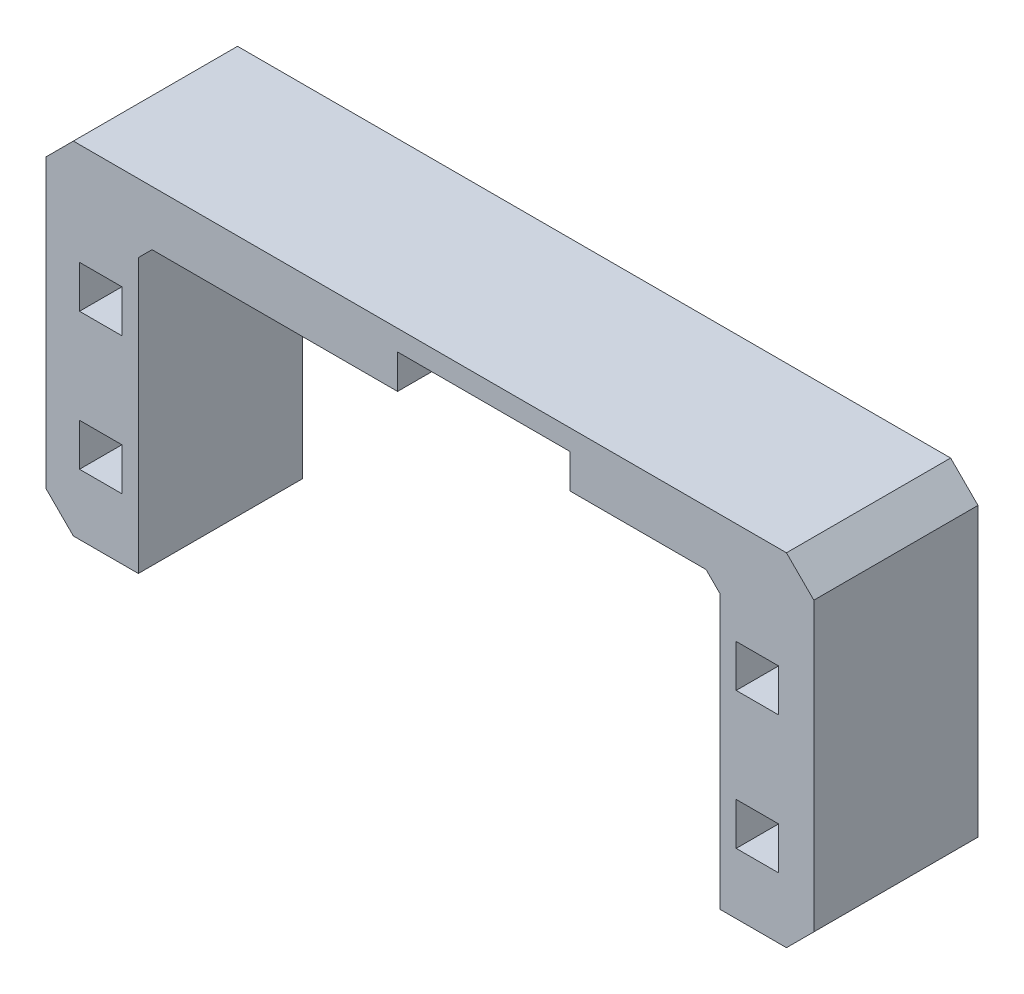
ISO-10303-21;
HEADER;
FILE_DESCRIPTION(('STEP AP214'),'2;1');
FILE_NAME('part.step','',(''),(''),'','','');
FILE_SCHEMA(('AUTOMOTIVE_DESIGN { 1 0 10303 214 1 1 1 1 }'));
ENDSEC;
DATA;
#1=APPLICATION_CONTEXT('core data for automotive mechanical design processes');
#2=APPLICATION_PROTOCOL_DEFINITION('international standard','automotive_design',2000,#1);
#3=PRODUCT_CONTEXT('',#1,'mechanical');
#4=PRODUCT('Part','Part','',(#3));
#5=PRODUCT_RELATED_PRODUCT_CATEGORY('part','',(#4));
#6=PRODUCT_DEFINITION_FORMATION('','',#4);
#7=PRODUCT_DEFINITION_CONTEXT('part definition',#1,'design');
#8=PRODUCT_DEFINITION('design','',#6,#7);
#9=PRODUCT_DEFINITION_SHAPE('','',#8);
#10=(LENGTH_UNIT() NAMED_UNIT(*) SI_UNIT(.MILLI.,.METRE.));
#11=(NAMED_UNIT(*) PLANE_ANGLE_UNIT() SI_UNIT($,.RADIAN.));
#12=(NAMED_UNIT(*) SI_UNIT($,.STERADIAN.) SOLID_ANGLE_UNIT());
#13=UNCERTAINTY_MEASURE_WITH_UNIT(LENGTH_MEASURE(1.E-05),#10,'distance_accuracy_value','');
#14=(GEOMETRIC_REPRESENTATION_CONTEXT(3) GLOBAL_UNCERTAINTY_ASSIGNED_CONTEXT((#13)) GLOBAL_UNIT_ASSIGNED_CONTEXT((#10,
#11,#12)) REPRESENTATION_CONTEXT('',''));
#15=CARTESIAN_POINT('',(0.,0.,0.));
#16=DIRECTION('',(0.,0.,1.));
#17=DIRECTION('',(1.,0.,0.));
#18=AXIS2_PLACEMENT_3D('',#15,#16,#17);
#19=CARTESIAN_POINT('',(0.,0.,12.));
#20=DIRECTION('',(0.,0.,-1.));
#21=DIRECTION('',(-1.,0.,0.));
#22=AXIS2_PLACEMENT_3D('',#19,#20,#21);
#23=PLANE('',#22);
#24=DIRECTION('',(0.,-1.,0.));
#25=VECTOR('',#24,1.);
#26=CARTESIAN_POINT('',(27.0299671173096,36.4287460327149,12.));
#27=LINE('',#26,#25);
#28=CARTESIAN_POINT('',(27.0299671173096,36.4287460327149,12.));
#29=VERTEX_POINT('',#28);
#30=CARTESIAN_POINT('',(27.0299671173096,33.3287460327149,12.));
#31=VERTEX_POINT('',#30);
#32=EDGE_CURVE('E264',#29,#31,#27,.T.);
#33=ORIENTED_EDGE('',*,*,#32,.T.);
#34=DIRECTION('',(-1.,0.,0.));
#35=VECTOR('',#34,1.);
#36=CARTESIAN_POINT('',(27.0299671173096,33.3287460327149,12.));
#37=LINE('',#36,#35);
#38=CARTESIAN_POINT('',(23.9299671173096,33.3287460327149,12.));
#39=VERTEX_POINT('',#38);
#40=EDGE_CURVE('E258',#31,#39,#37,.T.);
#41=ORIENTED_EDGE('',*,*,#40,.T.);
#42=DIRECTION('',(0.,1.,0.));
#43=VECTOR('',#42,1.);
#44=CARTESIAN_POINT('',(23.9299671173096,36.4287460327149,12.));
#45=LINE('',#44,#43);
#46=CARTESIAN_POINT('',(23.9299671173096,36.4287460327149,12.));
#47=VERTEX_POINT('',#46);
#48=EDGE_CURVE('E267',#39,#47,#45,.T.);
#49=ORIENTED_EDGE('',*,*,#48,.T.);
#50=DIRECTION('',(1.,0.,0.));
#51=VECTOR('',#50,1.);
#52=CARTESIAN_POINT('',(27.0299671173096,36.4287460327149,12.));
#53=LINE('',#52,#51);
#54=EDGE_CURVE('E50',#47,#29,#53,.T.);
#55=ORIENTED_EDGE('',*,*,#54,.T.);
#56=EDGE_LOOP('',(#33,#41,#49,#55));
#57=FACE_BOUND('',#56,.T.);
#58=DIRECTION('',(0.,-1.,0.));
#59=VECTOR('',#58,1.);
#60=CARTESIAN_POINT('',(27.0299671173096,26.4287479400635,12.));
#61=LINE('',#60,#59);
#62=CARTESIAN_POINT('',(27.0299671173096,26.4287479400635,12.));
#63=VERTEX_POINT('',#62);
#64=CARTESIAN_POINT('',(27.0299671173096,23.3287479400635,12.));
#65=VERTEX_POINT('',#64);
#66=EDGE_CURVE('E302',#63,#65,#61,.T.);
#67=ORIENTED_EDGE('',*,*,#66,.T.);
#68=DIRECTION('',(-1.,0.,0.));
#69=VECTOR('',#68,1.);
#70=CARTESIAN_POINT('',(27.0299671173096,23.3287479400635,12.));
#71=LINE('',#70,#69);
#72=CARTESIAN_POINT('',(23.9299671173096,23.3287479400635,12.));
#73=VERTEX_POINT('',#72);
#74=EDGE_CURVE('E292',#65,#73,#71,.T.);
#75=ORIENTED_EDGE('',*,*,#74,.T.);
#76=DIRECTION('',(0.,1.,0.));
#77=VECTOR('',#76,1.);
#78=CARTESIAN_POINT('',(23.9299671173096,26.4287479400635,12.));
#79=LINE('',#78,#77);
#80=CARTESIAN_POINT('',(23.9299671173096,26.4287479400635,12.));
#81=VERTEX_POINT('',#80);
#82=EDGE_CURVE('E295',#73,#81,#79,.T.);
#83=ORIENTED_EDGE('',*,*,#82,.T.);
#84=DIRECTION('',(1.,0.,0.));
#85=VECTOR('',#84,1.);
#86=CARTESIAN_POINT('',(27.0299671173096,26.4287479400635,12.));
#87=LINE('',#86,#85);
#88=EDGE_CURVE('E299',#81,#63,#87,.T.);
#89=ORIENTED_EDGE('',*,*,#88,.T.);
#90=EDGE_LOOP('',(#67,#75,#83,#89));
#91=FACE_BOUND('',#90,.T.);
#92=DIRECTION('',(-1.,0.,0.));
#93=VECTOR('',#92,1.);
#94=CARTESIAN_POINT('',(75.0299652099609,23.3287479400635,12.));
#95=LINE('',#94,#93);
#96=CARTESIAN_POINT('',(75.0299652099609,23.3287479400635,12.));
#97=VERTEX_POINT('',#96);
#98=CARTESIAN_POINT('',(71.929965209961,23.3287479400635,12.));
#99=VERTEX_POINT('',#98);
#100=EDGE_CURVE('E334',#97,#99,#95,.T.);
#101=ORIENTED_EDGE('',*,*,#100,.T.);
#102=DIRECTION('',(0.,1.,0.));
#103=VECTOR('',#102,1.);
#104=CARTESIAN_POINT('',(71.929965209961,26.4287479400635,12.));
#105=LINE('',#104,#103);
#106=CARTESIAN_POINT('',(71.929965209961,26.4287479400635,12.));
#107=VERTEX_POINT('',#106);
#108=EDGE_CURVE('E324',#99,#107,#105,.T.);
#109=ORIENTED_EDGE('',*,*,#108,.T.);
#110=DIRECTION('',(1.,0.,0.));
#111=VECTOR('',#110,1.);
#112=CARTESIAN_POINT('',(75.0299652099609,26.4287479400635,12.));
#113=LINE('',#112,#111);
#114=CARTESIAN_POINT('',(75.0299652099609,26.4287479400635,12.));
#115=VERTEX_POINT('',#114);
#116=EDGE_CURVE('E327',#107,#115,#113,.T.);
#117=ORIENTED_EDGE('',*,*,#116,.T.);
#118=DIRECTION('',(0.,-1.,0.));
#119=VECTOR('',#118,1.);
#120=CARTESIAN_POINT('',(75.0299652099609,26.4287479400635,12.));
#121=LINE('',#120,#119);
#122=EDGE_CURVE('E331',#115,#97,#121,.T.);
#123=ORIENTED_EDGE('',*,*,#122,.T.);
#124=EDGE_LOOP('',(#101,#109,#117,#123));
#125=FACE_BOUND('',#124,.T.);
#126=DIRECTION('',(-1.,0.,0.));
#127=VECTOR('',#126,1.);
#128=CARTESIAN_POINT('',(75.0299652099609,33.3287460327149,12.));
#129=LINE('',#128,#127);
#130=CARTESIAN_POINT('',(75.0299652099609,33.3287460327149,12.));
#131=VERTEX_POINT('',#130);
#132=CARTESIAN_POINT('',(71.929965209961,33.3287460327149,12.));
#133=VERTEX_POINT('',#132);
#134=EDGE_CURVE('E366',#131,#133,#129,.T.);
#135=ORIENTED_EDGE('',*,*,#134,.T.);
#136=DIRECTION('',(0.,1.,0.));
#137=VECTOR('',#136,1.);
#138=CARTESIAN_POINT('',(71.929965209961,36.4287460327149,12.));
#139=LINE('',#138,#137);
#140=CARTESIAN_POINT('',(71.929965209961,36.4287460327149,12.));
#141=VERTEX_POINT('',#140);
#142=EDGE_CURVE('E356',#133,#141,#139,.T.);
#143=ORIENTED_EDGE('',*,*,#142,.T.);
#144=DIRECTION('',(1.,0.,0.));
#145=VECTOR('',#144,1.);
#146=CARTESIAN_POINT('',(75.0299652099609,36.4287460327149,12.));
#147=LINE('',#146,#145);
#148=CARTESIAN_POINT('',(75.0299652099609,36.4287460327149,12.));
#149=VERTEX_POINT('',#148);
#150=EDGE_CURVE('E359',#141,#149,#147,.T.);
#151=ORIENTED_EDGE('',*,*,#150,.T.);
#152=DIRECTION('',(0.,-1.,0.));
#153=VECTOR('',#152,1.);
#154=CARTESIAN_POINT('',(75.0299652099609,36.4287460327149,12.));
#155=LINE('',#154,#153);
#156=EDGE_CURVE('E363',#149,#131,#155,.T.);
#157=ORIENTED_EDGE('',*,*,#156,.T.);
#158=EDGE_LOOP('',(#135,#143,#151,#157));
#159=FACE_BOUND('',#158,.T.);
#160=DIRECTION('',(0.,-1.,0.));
#161=VECTOR('',#160,1.);
#162=CARTESIAN_POINT('',(21.4799671173096,20.8787479400635,12.));
#163=LINE('',#162,#161);
#164=CARTESIAN_POINT('',(21.4799671173096,41.8787460327148,12.));
#165=VERTEX_POINT('',#164);
#166=CARTESIAN_POINT('',(21.4799671173096,20.8787479400635,12.));
#167=VERTEX_POINT('',#166);
#168=EDGE_CURVE('E412',#165,#167,#163,.T.);
#169=ORIENTED_EDGE('',*,*,#168,.T.);
#170=DIRECTION('',(0.707106781186548,-0.707106781186548,0.));
#171=VECTOR('',#170,1.);
#172=CARTESIAN_POINT('',(23.4799671173096,18.8787479400635,12.));
#173=LINE('',#172,#171);
#174=CARTESIAN_POINT('',(23.4799671173096,18.8787479400635,12.));
#175=VERTEX_POINT('',#174);
#176=EDGE_CURVE('E415',#167,#175,#173,.T.);
#177=ORIENTED_EDGE('',*,*,#176,.T.);
#178=DIRECTION('',(1.,0.,0.));
#179=VECTOR('',#178,1.);
#180=CARTESIAN_POINT('',(23.4799671173096,18.8787479400635,12.));
#181=LINE('',#180,#179);
#182=CARTESIAN_POINT('',(28.2299671173096,18.8787479400635,12.));
#183=VERTEX_POINT('',#182);
#184=EDGE_CURVE('E418',#175,#183,#181,.T.);
#185=ORIENTED_EDGE('',*,*,#184,.T.);
#186=DIRECTION('',(0.,1.,0.));
#187=VECTOR('',#186,1.);
#188=CARTESIAN_POINT('',(28.2299671173096,18.8787479400635,12.));
#189=LINE('',#188,#187);
#190=CARTESIAN_POINT('',(28.2299671173096,38.8787460327148,12.));
#191=VERTEX_POINT('',#190);
#192=EDGE_CURVE('E420',#183,#191,#189,.T.);
#193=ORIENTED_EDGE('',*,*,#192,.T.);
#194=DIRECTION('',(0.707106781186547,0.707106781186547,0.));
#195=VECTOR('',#194,1.);
#196=CARTESIAN_POINT('',(28.2299671173096,38.8787460327148,12.));
#197=LINE('',#196,#195);
#198=CARTESIAN_POINT('',(29.2299671173096,39.8787460327148,12.));
#199=VERTEX_POINT('',#198);
#200=EDGE_CURVE('E422',#191,#199,#197,.T.);
#201=ORIENTED_EDGE('',*,*,#200,.T.);
#202=DIRECTION('',(1.,0.,0.));
#203=VECTOR('',#202,1.);
#204=CARTESIAN_POINT('',(29.2299671173096,39.8787460327148,12.));
#205=LINE('',#204,#203);
#206=CARTESIAN_POINT('',(47.1799652099609,39.8787460327148,12.));
#207=VERTEX_POINT('',#206);
#208=EDGE_CURVE('E424',#199,#207,#205,.T.);
#209=ORIENTED_EDGE('',*,*,#208,.T.);
#210=DIRECTION('',(0.,-1.,0.));
#211=VECTOR('',#210,1.);
#212=CARTESIAN_POINT('',(47.1799652099609,39.8787460327148,12.));
#213=LINE('',#212,#211);
#214=CARTESIAN_POINT('',(47.1799652099609,42.3787460327148,12.));
#215=VERTEX_POINT('',#214);
#216=EDGE_CURVE('E388',#215,#207,#213,.T.);
#217=ORIENTED_EDGE('',*,*,#216,.F.);
#218=DIRECTION('',(1.,0.,0.));
#219=VECTOR('',#218,1.);
#220=CARTESIAN_POINT('',(53.4799652099609,42.3787460327148,12.));
#221=LINE('',#220,#219);
#222=CARTESIAN_POINT('',(59.7799652099609,42.3787460327148,12.));
#223=VERTEX_POINT('',#222);
#224=EDGE_CURVE('E426',#215,#223,#221,.T.);
#225=ORIENTED_EDGE('',*,*,#224,.T.);
#226=DIRECTION('',(0.,1.,0.));
#227=VECTOR('',#226,1.);
#228=CARTESIAN_POINT('',(59.7799652099609,39.8787460327148,12.));
#229=LINE('',#228,#227);
#230=CARTESIAN_POINT('',(59.7799652099609,39.8787460327148,12.));
#231=VERTEX_POINT('',#230);
#232=EDGE_CURVE('E400',#231,#223,#229,.T.);
#233=ORIENTED_EDGE('',*,*,#232,.F.);
#234=DIRECTION('',(1.,0.,0.));
#235=VECTOR('',#234,1.);
#236=CARTESIAN_POINT('',(69.7299652099609,39.8787460327149,12.));
#237=LINE('',#236,#235);
#238=CARTESIAN_POINT('',(69.7299652099609,39.8787460327149,12.));
#239=VERTEX_POINT('',#238);
#240=EDGE_CURVE('E428',#231,#239,#237,.T.);
#241=ORIENTED_EDGE('',*,*,#240,.T.);
#242=DIRECTION('',(0.707106781186547,-0.707106781186547,0.));
#243=VECTOR('',#242,1.);
#244=CARTESIAN_POINT('',(70.7299652099609,38.8787460327149,12.));
#245=LINE('',#244,#243);
#246=CARTESIAN_POINT('',(70.7299652099609,38.8787460327149,12.));
#247=VERTEX_POINT('',#246);
#248=EDGE_CURVE('E430',#239,#247,#245,.T.);
#249=ORIENTED_EDGE('',*,*,#248,.T.);
#250=DIRECTION('',(0.,-1.,0.));
#251=VECTOR('',#250,1.);
#252=CARTESIAN_POINT('',(70.7299652099609,18.8787479400635,12.));
#253=LINE('',#252,#251);
#254=CARTESIAN_POINT('',(70.7299652099609,18.8787479400635,12.));
#255=VERTEX_POINT('',#254);
#256=EDGE_CURVE('E432',#247,#255,#253,.T.);
#257=ORIENTED_EDGE('',*,*,#256,.T.);
#258=DIRECTION('',(1.,0.,0.));
#259=VECTOR('',#258,1.);
#260=CARTESIAN_POINT('',(70.7299652099609,18.8787479400635,12.));
#261=LINE('',#260,#259);
#262=CARTESIAN_POINT('',(75.6049652099609,18.8787479400635,12.));
#263=VERTEX_POINT('',#262);
#264=EDGE_CURVE('E434',#255,#263,#261,.T.);
#265=ORIENTED_EDGE('',*,*,#264,.T.);
#266=DIRECTION('',(0.707106781186548,0.707106781186547,0.));
#267=VECTOR('',#266,1.);
#268=CARTESIAN_POINT('',(75.6049652099609,18.8787479400635,12.));
#269=LINE('',#268,#267);
#270=CARTESIAN_POINT('',(77.6049652099609,20.8787479400635,12.));
#271=VERTEX_POINT('',#270);
#272=EDGE_CURVE('E436',#263,#271,#269,.T.);
#273=ORIENTED_EDGE('',*,*,#272,.T.);
#274=DIRECTION('',(0.,1.,0.));
#275=VECTOR('',#274,1.);
#276=CARTESIAN_POINT('',(77.6049652099609,20.8787479400635,12.));
#277=LINE('',#276,#275);
#278=CARTESIAN_POINT('',(77.6049652099609,41.8787460327148,12.));
#279=VERTEX_POINT('',#278);
#280=EDGE_CURVE('E438',#271,#279,#277,.T.);
#281=ORIENTED_EDGE('',*,*,#280,.T.);
#282=DIRECTION('',(-0.707106781186547,0.707106781186547,0.));
#283=VECTOR('',#282,1.);
#284=CARTESIAN_POINT('',(77.6049652099609,41.8787460327148,12.));
#285=LINE('',#284,#283);
#286=CARTESIAN_POINT('',(75.6049652099609,43.8787460327149,12.));
#287=VERTEX_POINT('',#286);
#288=EDGE_CURVE('E440',#279,#287,#285,.T.);
#289=ORIENTED_EDGE('',*,*,#288,.T.);
#290=DIRECTION('',(-1.,0.,0.));
#291=VECTOR('',#290,1.);
#292=CARTESIAN_POINT('',(23.4799671173096,43.8787460327149,12.));
#293=LINE('',#292,#291);
#294=CARTESIAN_POINT('',(23.4799671173096,43.8787460327149,12.));
#295=VERTEX_POINT('',#294);
#296=EDGE_CURVE('E442',#287,#295,#293,.T.);
#297=ORIENTED_EDGE('',*,*,#296,.T.);
#298=DIRECTION('',(-0.707106781186547,-0.707106781186548,0.));
#299=VECTOR('',#298,1.);
#300=CARTESIAN_POINT('',(21.4799671173096,41.8787460327148,12.));
#301=LINE('',#300,#299);
#302=EDGE_CURVE('E444',#295,#165,#301,.T.);
#303=ORIENTED_EDGE('',*,*,#302,.T.);
#304=EDGE_LOOP('',(#169,#177,#185,#193,#201,#209,#217,#225,#233,#241,#249,#257,#265,#273,#281,
#289,#297,#303));
#305=FACE_BOUND('',#304,.T.);
#306=ADVANCED_FACE('F35',(#57,#91,#125,#159,#305),#23,.F.);
#307=CARTESIAN_POINT('',(0.,0.,0.));
#308=DIRECTION('',(0.,0.,-1.));
#309=DIRECTION('',(-1.,0.,0.));
#310=AXIS2_PLACEMENT_3D('',#307,#308,#309);
#311=PLANE('',#310);
#312=DIRECTION('',(-1.,0.,0.));
#313=VECTOR('',#312,1.);
#314=CARTESIAN_POINT('',(27.0299671173096,33.3287460327149,0.));
#315=LINE('',#314,#313);
#316=CARTESIAN_POINT('',(27.0299671173096,33.3287460327149,0.));
#317=VERTEX_POINT('',#316);
#318=CARTESIAN_POINT('',(23.9299671173096,33.3287460327149,0.));
#319=VERTEX_POINT('',#318);
#320=EDGE_CURVE('E58',#317,#319,#315,.T.);
#321=ORIENTED_EDGE('',*,*,#320,.F.);
#322=DIRECTION('',(0.,-1.,0.));
#323=VECTOR('',#322,1.);
#324=CARTESIAN_POINT('',(27.0299671173096,36.4287460327149,0.));
#325=LINE('',#324,#323);
#326=CARTESIAN_POINT('',(27.0299671173096,36.4287460327149,0.));
#327=VERTEX_POINT('',#326);
#328=EDGE_CURVE('E273',#327,#317,#325,.T.);
#329=ORIENTED_EDGE('',*,*,#328,.F.);
#330=DIRECTION('',(1.,0.,0.));
#331=VECTOR('',#330,1.);
#332=CARTESIAN_POINT('',(27.0299671173096,36.4287460327149,0.));
#333=LINE('',#332,#331);
#334=CARTESIAN_POINT('',(23.9299671173096,36.4287460327149,0.));
#335=VERTEX_POINT('',#334);
#336=EDGE_CURVE('E276',#335,#327,#333,.T.);
#337=ORIENTED_EDGE('',*,*,#336,.F.);
#338=DIRECTION('',(0.,1.,0.));
#339=VECTOR('',#338,1.);
#340=CARTESIAN_POINT('',(23.9299671173096,36.4287460327149,0.));
#341=LINE('',#340,#339);
#342=EDGE_CURVE('E282',#319,#335,#341,.T.);
#343=ORIENTED_EDGE('',*,*,#342,.F.);
#344=EDGE_LOOP('',(#321,#329,#337,#343));
#345=FACE_BOUND('',#344,.T.);
#346=DIRECTION('',(-1.,0.,0.));
#347=VECTOR('',#346,1.);
#348=CARTESIAN_POINT('',(27.0299671173096,23.3287479400635,0.));
#349=LINE('',#348,#347);
#350=CARTESIAN_POINT('',(27.0299671173096,23.3287479400635,0.));
#351=VERTEX_POINT('',#350);
#352=CARTESIAN_POINT('',(23.9299671173096,23.3287479400635,0.));
#353=VERTEX_POINT('',#352);
#354=EDGE_CURVE('E288',#351,#353,#349,.T.);
#355=ORIENTED_EDGE('',*,*,#354,.F.);
#356=DIRECTION('',(0.,-1.,0.));
#357=VECTOR('',#356,1.);
#358=CARTESIAN_POINT('',(27.0299671173096,26.4287479400635,0.));
#359=LINE('',#358,#357);
#360=CARTESIAN_POINT('',(27.0299671173096,26.4287479400635,0.));
#361=VERTEX_POINT('',#360);
#362=EDGE_CURVE('E296',#361,#351,#359,.T.);
#363=ORIENTED_EDGE('',*,*,#362,.F.);
#364=DIRECTION('',(1.,0.,0.));
#365=VECTOR('',#364,1.);
#366=CARTESIAN_POINT('',(27.0299671173096,26.4287479400635,0.));
#367=LINE('',#366,#365);
#368=CARTESIAN_POINT('',(23.9299671173096,26.4287479400635,0.));
#369=VERTEX_POINT('',#368);
#370=EDGE_CURVE('E310',#369,#361,#367,.T.);
#371=ORIENTED_EDGE('',*,*,#370,.F.);
#372=DIRECTION('',(0.,1.,0.));
#373=VECTOR('',#372,1.);
#374=CARTESIAN_POINT('',(23.9299671173096,26.4287479400635,0.));
#375=LINE('',#374,#373);
#376=EDGE_CURVE('E307',#353,#369,#375,.T.);
#377=ORIENTED_EDGE('',*,*,#376,.F.);
#378=EDGE_LOOP('',(#355,#363,#371,#377));
#379=FACE_BOUND('',#378,.T.);
#380=DIRECTION('',(0.,1.,0.));
#381=VECTOR('',#380,1.);
#382=CARTESIAN_POINT('',(71.929965209961,26.4287479400635,0.));
#383=LINE('',#382,#381);
#384=CARTESIAN_POINT('',(71.929965209961,23.3287479400635,0.));
#385=VERTEX_POINT('',#384);
#386=CARTESIAN_POINT('',(71.929965209961,26.4287479400635,0.));
#387=VERTEX_POINT('',#386);
#388=EDGE_CURVE('E317',#385,#387,#383,.T.);
#389=ORIENTED_EDGE('',*,*,#388,.F.);
#390=DIRECTION('',(-1.,0.,0.));
#391=VECTOR('',#390,1.);
#392=CARTESIAN_POINT('',(75.0299652099609,23.3287479400635,0.));
#393=LINE('',#392,#391);
#394=CARTESIAN_POINT('',(75.0299652099609,23.3287479400635,0.));
#395=VERTEX_POINT('',#394);
#396=EDGE_CURVE('E328',#395,#385,#393,.T.);
#397=ORIENTED_EDGE('',*,*,#396,.F.);
#398=DIRECTION('',(0.,-1.,0.));
#399=VECTOR('',#398,1.);
#400=CARTESIAN_POINT('',(75.0299652099609,26.4287479400635,0.));
#401=LINE('',#400,#399);
#402=CARTESIAN_POINT('',(75.0299652099609,26.4287479400635,0.));
#403=VERTEX_POINT('',#402);
#404=EDGE_CURVE('E342',#403,#395,#401,.T.);
#405=ORIENTED_EDGE('',*,*,#404,.F.);
#406=DIRECTION('',(1.,0.,0.));
#407=VECTOR('',#406,1.);
#408=CARTESIAN_POINT('',(75.0299652099609,26.4287479400635,0.));
#409=LINE('',#408,#407);
#410=EDGE_CURVE('E339',#387,#403,#409,.T.);
#411=ORIENTED_EDGE('',*,*,#410,.F.);
#412=EDGE_LOOP('',(#389,#397,#405,#411));
#413=FACE_BOUND('',#412,.T.);
#414=DIRECTION('',(0.,1.,0.));
#415=VECTOR('',#414,1.);
#416=CARTESIAN_POINT('',(71.929965209961,36.4287460327149,0.));
#417=LINE('',#416,#415);
#418=CARTESIAN_POINT('',(71.929965209961,33.3287460327149,0.));
#419=VERTEX_POINT('',#418);
#420=CARTESIAN_POINT('',(71.929965209961,36.4287460327149,0.));
#421=VERTEX_POINT('',#420);
#422=EDGE_CURVE('E349',#419,#421,#417,.T.);
#423=ORIENTED_EDGE('',*,*,#422,.F.);
#424=DIRECTION('',(-1.,0.,0.));
#425=VECTOR('',#424,1.);
#426=CARTESIAN_POINT('',(75.0299652099609,33.3287460327149,0.));
#427=LINE('',#426,#425);
#428=CARTESIAN_POINT('',(75.0299652099609,33.3287460327149,0.));
#429=VERTEX_POINT('',#428);
#430=EDGE_CURVE('E360',#429,#419,#427,.T.);
#431=ORIENTED_EDGE('',*,*,#430,.F.);
#432=DIRECTION('',(0.,-1.,0.));
#433=VECTOR('',#432,1.);
#434=CARTESIAN_POINT('',(75.0299652099609,36.4287460327149,0.));
#435=LINE('',#434,#433);
#436=CARTESIAN_POINT('',(75.0299652099609,36.4287460327149,0.));
#437=VERTEX_POINT('',#436);
#438=EDGE_CURVE('E374',#437,#429,#435,.T.);
#439=ORIENTED_EDGE('',*,*,#438,.F.);
#440=DIRECTION('',(1.,0.,0.));
#441=VECTOR('',#440,1.);
#442=CARTESIAN_POINT('',(75.0299652099609,36.4287460327149,0.));
#443=LINE('',#442,#441);
#444=EDGE_CURVE('E371',#421,#437,#443,.T.);
#445=ORIENTED_EDGE('',*,*,#444,.F.);
#446=EDGE_LOOP('',(#423,#431,#439,#445));
#447=FACE_BOUND('',#446,.T.);
#448=DIRECTION('',(0.,-1.,0.));
#449=VECTOR('',#448,1.);
#450=CARTESIAN_POINT('',(21.4799671173096,20.8787479400635,0.));
#451=LINE('',#450,#449);
#452=CARTESIAN_POINT('',(21.4799671173096,41.8787460327148,0.));
#453=VERTEX_POINT('',#452);
#454=CARTESIAN_POINT('',(21.4799671173096,20.8787479400635,0.));
#455=VERTEX_POINT('',#454);
#456=EDGE_CURVE('E409',#453,#455,#451,.T.);
#457=ORIENTED_EDGE('',*,*,#456,.F.);
#458=DIRECTION('',(-0.707106781186547,-0.707106781186548,0.));
#459=VECTOR('',#458,1.);
#460=CARTESIAN_POINT('',(21.4799671173096,41.8787460327148,0.));
#461=LINE('',#460,#459);
#462=CARTESIAN_POINT('',(23.4799671173096,43.8787460327149,0.));
#463=VERTEX_POINT('',#462);
#464=EDGE_CURVE('E416',#463,#453,#461,.T.);
#465=ORIENTED_EDGE('',*,*,#464,.F.);
#466=DIRECTION('',(-1.,0.,0.));
#467=VECTOR('',#466,1.);
#468=CARTESIAN_POINT('',(23.4799671173096,43.8787460327149,0.));
#469=LINE('',#468,#467);
#470=CARTESIAN_POINT('',(75.6049652099609,43.8787460327149,0.));
#471=VERTEX_POINT('',#470);
#472=EDGE_CURVE('E475',#471,#463,#469,.T.);
#473=ORIENTED_EDGE('',*,*,#472,.F.);
#474=DIRECTION('',(-0.707106781186547,0.707106781186547,0.));
#475=VECTOR('',#474,1.);
#476=CARTESIAN_POINT('',(77.6049652099609,41.8787460327148,0.));
#477=LINE('',#476,#475);
#478=CARTESIAN_POINT('',(77.6049652099609,41.8787460327148,0.));
#479=VERTEX_POINT('',#478);
#480=EDGE_CURVE('E473',#479,#471,#477,.T.);
#481=ORIENTED_EDGE('',*,*,#480,.F.);
#482=DIRECTION('',(0.,1.,0.));
#483=VECTOR('',#482,1.);
#484=CARTESIAN_POINT('',(77.6049652099609,20.8787479400635,0.));
#485=LINE('',#484,#483);
#486=CARTESIAN_POINT('',(77.6049652099609,20.8787479400635,0.));
#487=VERTEX_POINT('',#486);
#488=EDGE_CURVE('E471',#487,#479,#485,.T.);
#489=ORIENTED_EDGE('',*,*,#488,.F.);
#490=DIRECTION('',(0.707106781186548,0.707106781186547,0.));
#491=VECTOR('',#490,1.);
#492=CARTESIAN_POINT('',(75.6049652099609,18.8787479400635,0.));
#493=LINE('',#492,#491);
#494=CARTESIAN_POINT('',(75.6049652099609,18.8787479400635,0.));
#495=VERTEX_POINT('',#494);
#496=EDGE_CURVE('E469',#495,#487,#493,.T.);
#497=ORIENTED_EDGE('',*,*,#496,.F.);
#498=DIRECTION('',(1.,0.,0.));
#499=VECTOR('',#498,1.);
#500=CARTESIAN_POINT('',(70.7299652099609,18.8787479400635,0.));
#501=LINE('',#500,#499);
#502=CARTESIAN_POINT('',(70.7299652099609,18.8787479400635,0.));
#503=VERTEX_POINT('',#502);
#504=EDGE_CURVE('E467',#503,#495,#501,.T.);
#505=ORIENTED_EDGE('',*,*,#504,.F.);
#506=DIRECTION('',(0.,-1.,0.));
#507=VECTOR('',#506,1.);
#508=CARTESIAN_POINT('',(70.7299652099609,18.8787479400635,0.));
#509=LINE('',#508,#507);
#510=CARTESIAN_POINT('',(70.7299652099609,38.8787460327149,0.));
#511=VERTEX_POINT('',#510);
#512=EDGE_CURVE('E465',#511,#503,#509,.T.);
#513=ORIENTED_EDGE('',*,*,#512,.F.);
#514=DIRECTION('',(0.707106781186547,-0.707106781186547,0.));
#515=VECTOR('',#514,1.);
#516=CARTESIAN_POINT('',(70.7299652099609,38.8787460327149,0.));
#517=LINE('',#516,#515);
#518=CARTESIAN_POINT('',(69.7299652099609,39.8787460327149,0.));
#519=VERTEX_POINT('',#518);
#520=EDGE_CURVE('E463',#519,#511,#517,.T.);
#521=ORIENTED_EDGE('',*,*,#520,.F.);
#522=DIRECTION('',(1.,0.,0.));
#523=VECTOR('',#522,1.);
#524=CARTESIAN_POINT('',(69.7299652099609,39.8787460327149,0.));
#525=LINE('',#524,#523);
#526=CARTESIAN_POINT('',(59.7799652099609,39.8787460327148,0.));
#527=VERTEX_POINT('',#526);
#528=EDGE_CURVE('E461',#527,#519,#525,.T.);
#529=ORIENTED_EDGE('',*,*,#528,.F.);
#530=DIRECTION('',(0.,1.,0.));
#531=VECTOR('',#530,1.);
#532=CARTESIAN_POINT('',(59.7799652099609,39.8787460327148,0.));
#533=LINE('',#532,#531);
#534=CARTESIAN_POINT('',(59.7799652099609,42.3787460327148,0.));
#535=VERTEX_POINT('',#534);
#536=EDGE_CURVE('E397',#527,#535,#533,.T.);
#537=ORIENTED_EDGE('',*,*,#536,.T.);
#538=DIRECTION('',(1.,0.,0.));
#539=VECTOR('',#538,1.);
#540=CARTESIAN_POINT('',(53.4799652099609,42.3787460327148,0.));
#541=LINE('',#540,#539);
#542=CARTESIAN_POINT('',(47.1799652099609,42.3787460327148,0.));
#543=VERTEX_POINT('',#542);
#544=EDGE_CURVE('E459',#543,#535,#541,.T.);
#545=ORIENTED_EDGE('',*,*,#544,.F.);
#546=DIRECTION('',(0.,-1.,0.));
#547=VECTOR('',#546,1.);
#548=CARTESIAN_POINT('',(47.1799652099609,39.8787460327148,0.));
#549=LINE('',#548,#547);
#550=CARTESIAN_POINT('',(47.1799652099609,39.8787460327148,0.));
#551=VERTEX_POINT('',#550);
#552=EDGE_CURVE('E381',#543,#551,#549,.T.);
#553=ORIENTED_EDGE('',*,*,#552,.T.);
#554=DIRECTION('',(1.,0.,0.));
#555=VECTOR('',#554,1.);
#556=CARTESIAN_POINT('',(29.2299671173096,39.8787460327148,0.));
#557=LINE('',#556,#555);
#558=CARTESIAN_POINT('',(29.2299671173096,39.8787460327148,0.));
#559=VERTEX_POINT('',#558);
#560=EDGE_CURVE('E457',#559,#551,#557,.T.);
#561=ORIENTED_EDGE('',*,*,#560,.F.);
#562=DIRECTION('',(0.707106781186547,0.707106781186547,0.));
#563=VECTOR('',#562,1.);
#564=CARTESIAN_POINT('',(28.2299671173096,38.8787460327148,0.));
#565=LINE('',#564,#563);
#566=CARTESIAN_POINT('',(28.2299671173096,38.8787460327148,0.));
#567=VERTEX_POINT('',#566);
#568=EDGE_CURVE('E455',#567,#559,#565,.T.);
#569=ORIENTED_EDGE('',*,*,#568,.F.);
#570=DIRECTION('',(0.,1.,0.));
#571=VECTOR('',#570,1.);
#572=CARTESIAN_POINT('',(28.2299671173096,18.8787479400635,0.));
#573=LINE('',#572,#571);
#574=CARTESIAN_POINT('',(28.2299671173096,18.8787479400635,0.));
#575=VERTEX_POINT('',#574);
#576=EDGE_CURVE('E453',#575,#567,#573,.T.);
#577=ORIENTED_EDGE('',*,*,#576,.F.);
#578=DIRECTION('',(1.,0.,0.));
#579=VECTOR('',#578,1.);
#580=CARTESIAN_POINT('',(23.4799671173096,18.8787479400635,0.));
#581=LINE('',#580,#579);
#582=CARTESIAN_POINT('',(23.4799671173096,18.8787479400635,0.));
#583=VERTEX_POINT('',#582);
#584=EDGE_CURVE('E451',#583,#575,#581,.T.);
#585=ORIENTED_EDGE('',*,*,#584,.F.);
#586=DIRECTION('',(0.707106781186548,-0.707106781186548,0.));
#587=VECTOR('',#586,1.);
#588=CARTESIAN_POINT('',(23.4799671173096,18.8787479400635,0.));
#589=LINE('',#588,#587);
#590=EDGE_CURVE('E449',#455,#583,#589,.T.);
#591=ORIENTED_EDGE('',*,*,#590,.F.);
#592=EDGE_LOOP('',(#457,#465,#473,#481,#489,#497,#505,#513,#521,#529,#537,#545,#553,#561,#569,
#577,#585,#591));
#593=FACE_BOUND('',#592,.T.);
#594=ADVANCED_FACE('F523',(#345,#379,#413,#447,#593),#311,.T.);
#595=CARTESIAN_POINT('',(21.4799671173096,20.8787479400635,12.));
#596=DIRECTION('',(1.,0.,0.));
#597=DIRECTION('',(0.,0.,-1.));
#598=AXIS2_PLACEMENT_3D('',#595,#596,#597);
#599=PLANE('',#598);
#600=ORIENTED_EDGE('',*,*,#456,.T.);
#601=DIRECTION('',(0.,0.,-1.));
#602=VECTOR('',#601,1.);
#603=CARTESIAN_POINT('',(21.4799671173096,20.8787479400635,12.));
#604=LINE('',#603,#602);
#605=EDGE_CURVE('E11',#167,#455,#604,.T.);
#606=ORIENTED_EDGE('',*,*,#605,.F.);
#607=ORIENTED_EDGE('',*,*,#168,.F.);
#608=DIRECTION('',(0.,0.,-1.));
#609=VECTOR('',#608,1.);
#610=CARTESIAN_POINT('',(21.4799671173096,41.8787460327148,12.));
#611=LINE('',#610,#609);
#612=EDGE_CURVE('E446',#165,#453,#611,.T.);
#613=ORIENTED_EDGE('',*,*,#612,.T.);
#614=EDGE_LOOP('',(#600,#606,#607,#613));
#615=FACE_BOUND('',#614,.T.);
#616=ADVANCED_FACE('F37',(#615),#599,.F.);
#617=CARTESIAN_POINT('',(23.4799671173096,18.8787479400635,12.));
#618=DIRECTION('',(0.707106781186548,0.707106781186548,0.));
#619=DIRECTION('',(-0.707106781186548,0.707106781186548,0.));
#620=AXIS2_PLACEMENT_3D('',#617,#618,#619);
#621=PLANE('',#620);
#622=ORIENTED_EDGE('',*,*,#590,.T.);
#623=DIRECTION('',(0.,0.,-1.));
#624=VECTOR('',#623,1.);
#625=CARTESIAN_POINT('',(23.4799671173096,18.8787479400635,12.));
#626=LINE('',#625,#624);
#627=EDGE_CURVE('E43',#175,#583,#626,.T.);
#628=ORIENTED_EDGE('',*,*,#627,.F.);
#629=ORIENTED_EDGE('',*,*,#176,.F.);
#630=ORIENTED_EDGE('',*,*,#605,.T.);
#631=EDGE_LOOP('',(#622,#628,#629,#630));
#632=FACE_BOUND('',#631,.T.);
#633=ADVANCED_FACE('F540',(#632),#621,.F.);
#634=CARTESIAN_POINT('',(23.4799671173096,18.8787479400635,12.));
#635=DIRECTION('',(0.,1.,0.));
#636=DIRECTION('',(-1.,0.,0.));
#637=AXIS2_PLACEMENT_3D('',#634,#635,#636);
#638=PLANE('',#637);
#639=ORIENTED_EDGE('',*,*,#584,.T.);
#640=DIRECTION('',(0.,0.,-1.));
#641=VECTOR('',#640,1.);
#642=CARTESIAN_POINT('',(28.2299671173096,18.8787479400635,12.));
#643=LINE('',#642,#641);
#644=EDGE_CURVE('E510',#183,#575,#643,.T.);
#645=ORIENTED_EDGE('',*,*,#644,.F.);
#646=ORIENTED_EDGE('',*,*,#184,.F.);
#647=ORIENTED_EDGE('',*,*,#627,.T.);
#648=EDGE_LOOP('',(#639,#645,#646,#647));
#649=FACE_BOUND('',#648,.T.);
#650=ADVANCED_FACE('F517',(#649),#638,.F.);
#651=CARTESIAN_POINT('',(28.2299671173096,18.8787479400635,12.));
#652=DIRECTION('',(-1.,0.,0.));
#653=DIRECTION('',(0.,0.,1.));
#654=AXIS2_PLACEMENT_3D('',#651,#652,#653);
#655=PLANE('',#654);
#656=ORIENTED_EDGE('',*,*,#576,.T.);
#657=DIRECTION('',(0.,0.,-1.));
#658=VECTOR('',#657,1.);
#659=CARTESIAN_POINT('',(28.2299671173096,38.8787460327148,12.));
#660=LINE('',#659,#658);
#661=EDGE_CURVE('E507',#191,#567,#660,.T.);
#662=ORIENTED_EDGE('',*,*,#661,.F.);
#663=ORIENTED_EDGE('',*,*,#192,.F.);
#664=ORIENTED_EDGE('',*,*,#644,.T.);
#665=EDGE_LOOP('',(#656,#662,#663,#664));
#666=FACE_BOUND('',#665,.T.);
#667=ADVANCED_FACE('F528',(#666),#655,.F.);
#668=CARTESIAN_POINT('',(28.2299671173096,38.8787460327148,12.));
#669=DIRECTION('',(-0.707106781186548,0.707106781186548,0.));
#670=DIRECTION('',(-0.707106781186548,-0.707106781186548,0.));
#671=AXIS2_PLACEMENT_3D('',#668,#669,#670);
#672=PLANE('',#671);
#673=ORIENTED_EDGE('',*,*,#568,.T.);
#674=DIRECTION('',(0.,0.,-1.));
#675=VECTOR('',#674,1.);
#676=CARTESIAN_POINT('',(29.2299671173096,39.8787460327148,12.));
#677=LINE('',#676,#675);
#678=EDGE_CURVE('E504',#199,#559,#677,.T.);
#679=ORIENTED_EDGE('',*,*,#678,.F.);
#680=ORIENTED_EDGE('',*,*,#200,.F.);
#681=ORIENTED_EDGE('',*,*,#661,.T.);
#682=EDGE_LOOP('',(#673,#679,#680,#681));
#683=FACE_BOUND('',#682,.T.);
#684=ADVANCED_FACE('F532',(#683),#672,.F.);
#685=CARTESIAN_POINT('',(29.2299671173096,39.8787460327148,12.));
#686=DIRECTION('',(0.,1.,0.));
#687=DIRECTION('',(0.,0.,1.));
#688=AXIS2_PLACEMENT_3D('',#685,#686,#687);
#689=PLANE('',#688);
#690=ORIENTED_EDGE('',*,*,#560,.T.);
#691=DIRECTION('',(0.,0.,-1.));
#692=VECTOR('',#691,1.);
#693=CARTESIAN_POINT('',(47.1799652099609,39.8787460327148,12.));
#694=LINE('',#693,#692);
#695=EDGE_CURVE('E394',#207,#551,#694,.T.);
#696=ORIENTED_EDGE('',*,*,#695,.F.);
#697=ORIENTED_EDGE('',*,*,#208,.F.);
#698=ORIENTED_EDGE('',*,*,#678,.T.);
#699=EDGE_LOOP('',(#690,#696,#697,#698));
#700=FACE_BOUND('',#699,.T.);
#701=ADVANCED_FACE('F598',(#700),#689,.F.);
#702=CARTESIAN_POINT('',(53.4799652099609,42.3787460327148,12.));
#703=DIRECTION('',(0.,1.,0.));
#704=DIRECTION('',(0.,0.,1.));
#705=AXIS2_PLACEMENT_3D('',#702,#703,#704);
#706=PLANE('',#705);
#707=ORIENTED_EDGE('',*,*,#224,.F.);
#708=DIRECTION('',(0.,0.,-1.));
#709=VECTOR('',#708,1.);
#710=CARTESIAN_POINT('',(47.1799652099609,42.3787460327148,12.));
#711=LINE('',#710,#709);
#712=EDGE_CURVE('E391',#215,#543,#711,.T.);
#713=ORIENTED_EDGE('',*,*,#712,.T.);
#714=ORIENTED_EDGE('',*,*,#544,.T.);
#715=DIRECTION('',(0.,0.,-1.));
#716=VECTOR('',#715,1.);
#717=CARTESIAN_POINT('',(59.7799652099609,42.3787460327148,12.));
#718=LINE('',#717,#716);
#719=EDGE_CURVE('E406',#223,#535,#718,.T.);
#720=ORIENTED_EDGE('',*,*,#719,.F.);
#721=EDGE_LOOP('',(#707,#713,#714,#720));
#722=FACE_BOUND('',#721,.T.);
#723=ADVANCED_FACE('F592',(#722),#706,.F.);
#724=CARTESIAN_POINT('',(69.7299652099609,39.8787460327149,12.));
#725=DIRECTION('',(0.,1.,0.));
#726=DIRECTION('',(-1.,0.,0.));
#727=AXIS2_PLACEMENT_3D('',#724,#725,#726);
#728=PLANE('',#727);
#729=ORIENTED_EDGE('',*,*,#528,.T.);
#730=DIRECTION('',(0.,0.,-1.));
#731=VECTOR('',#730,1.);
#732=CARTESIAN_POINT('',(69.7299652099609,39.8787460327149,12.));
#733=LINE('',#732,#731);
#734=EDGE_CURVE('E501',#239,#519,#733,.T.);
#735=ORIENTED_EDGE('',*,*,#734,.F.);
#736=ORIENTED_EDGE('',*,*,#240,.F.);
#737=DIRECTION('',(0.,0.,-1.));
#738=VECTOR('',#737,1.);
#739=CARTESIAN_POINT('',(59.7799652099609,39.8787460327148,12.));
#740=LINE('',#739,#738);
#741=EDGE_CURVE('E403',#231,#527,#740,.T.);
#742=ORIENTED_EDGE('',*,*,#741,.T.);
#743=EDGE_LOOP('',(#729,#735,#736,#742));
#744=FACE_BOUND('',#743,.T.);
#745=ADVANCED_FACE('F584',(#744),#728,.F.);
#746=CARTESIAN_POINT('',(70.7299652099609,38.8787460327149,12.));
#747=DIRECTION('',(0.707106781186548,0.707106781186548,0.));
#748=DIRECTION('',(-0.707106781186548,0.707106781186548,0.));
#749=AXIS2_PLACEMENT_3D('',#746,#747,#748);
#750=PLANE('',#749);
#751=ORIENTED_EDGE('',*,*,#520,.T.);
#752=DIRECTION('',(0.,0.,-1.));
#753=VECTOR('',#752,1.);
#754=CARTESIAN_POINT('',(70.7299652099609,38.8787460327149,12.));
#755=LINE('',#754,#753);
#756=EDGE_CURVE('E498',#247,#511,#755,.T.);
#757=ORIENTED_EDGE('',*,*,#756,.F.);
#758=ORIENTED_EDGE('',*,*,#248,.F.);
#759=ORIENTED_EDGE('',*,*,#734,.T.);
#760=EDGE_LOOP('',(#751,#757,#758,#759));
#761=FACE_BOUND('',#760,.T.);
#762=ADVANCED_FACE('F581',(#761),#750,.F.);
#763=CARTESIAN_POINT('',(70.7299652099609,18.8787479400635,12.));
#764=DIRECTION('',(1.,0.,0.));
#765=DIRECTION('',(0.,0.,-1.));
#766=AXIS2_PLACEMENT_3D('',#763,#764,#765);
#767=PLANE('',#766);
#768=ORIENTED_EDGE('',*,*,#512,.T.);
#769=DIRECTION('',(0.,0.,-1.));
#770=VECTOR('',#769,1.);
#771=CARTESIAN_POINT('',(70.7299652099609,18.8787479400635,12.));
#772=LINE('',#771,#770);
#773=EDGE_CURVE('E495',#255,#503,#772,.T.);
#774=ORIENTED_EDGE('',*,*,#773,.F.);
#775=ORIENTED_EDGE('',*,*,#256,.F.);
#776=ORIENTED_EDGE('',*,*,#756,.T.);
#777=EDGE_LOOP('',(#768,#774,#775,#776));
#778=FACE_BOUND('',#777,.T.);
#779=ADVANCED_FACE('F576',(#778),#767,.F.);
#780=CARTESIAN_POINT('',(70.7299652099609,18.8787479400635,12.));
#781=DIRECTION('',(0.,1.,0.));
#782=DIRECTION('',(0.,0.,1.));
#783=AXIS2_PLACEMENT_3D('',#780,#781,#782);
#784=PLANE('',#783);
#785=ORIENTED_EDGE('',*,*,#504,.T.);
#786=DIRECTION('',(0.,0.,-1.));
#787=VECTOR('',#786,1.);
#788=CARTESIAN_POINT('',(75.6049652099609,18.8787479400635,12.));
#789=LINE('',#788,#787);
#790=EDGE_CURVE('E492',#263,#495,#789,.T.);
#791=ORIENTED_EDGE('',*,*,#790,.F.);
#792=ORIENTED_EDGE('',*,*,#264,.F.);
#793=ORIENTED_EDGE('',*,*,#773,.T.);
#794=EDGE_LOOP('',(#785,#791,#792,#793));
#795=FACE_BOUND('',#794,.T.);
#796=ADVANCED_FACE('F571',(#795),#784,.F.);
#797=CARTESIAN_POINT('',(75.6049652099609,18.8787479400635,12.));
#798=DIRECTION('',(-0.707106781186547,0.707106781186548,0.));
#799=DIRECTION('',(-0.707106781186548,-0.707106781186547,0.));
#800=AXIS2_PLACEMENT_3D('',#797,#798,#799);
#801=PLANE('',#800);
#802=ORIENTED_EDGE('',*,*,#496,.T.);
#803=DIRECTION('',(0.,0.,-1.));
#804=VECTOR('',#803,1.);
#805=CARTESIAN_POINT('',(77.6049652099609,20.8787479400635,12.));
#806=LINE('',#805,#804);
#807=EDGE_CURVE('E489',#271,#487,#806,.T.);
#808=ORIENTED_EDGE('',*,*,#807,.F.);
#809=ORIENTED_EDGE('',*,*,#272,.F.);
#810=ORIENTED_EDGE('',*,*,#790,.T.);
#811=EDGE_LOOP('',(#802,#808,#809,#810));
#812=FACE_BOUND('',#811,.T.);
#813=ADVANCED_FACE('F567',(#812),#801,.F.);
#814=CARTESIAN_POINT('',(77.6049652099609,20.8787479400635,12.));
#815=DIRECTION('',(-1.,0.,0.));
#816=DIRECTION('',(0.,0.,1.));
#817=AXIS2_PLACEMENT_3D('',#814,#815,#816);
#818=PLANE('',#817);
#819=ORIENTED_EDGE('',*,*,#488,.T.);
#820=DIRECTION('',(0.,0.,-1.));
#821=VECTOR('',#820,1.);
#822=CARTESIAN_POINT('',(77.6049652099609,41.8787460327148,12.));
#823=LINE('',#822,#821);
#824=EDGE_CURVE('E486',#279,#479,#823,.T.);
#825=ORIENTED_EDGE('',*,*,#824,.F.);
#826=ORIENTED_EDGE('',*,*,#280,.F.);
#827=ORIENTED_EDGE('',*,*,#807,.T.);
#828=EDGE_LOOP('',(#819,#825,#826,#827));
#829=FACE_BOUND('',#828,.T.);
#830=ADVANCED_FACE('F562',(#829),#818,.F.);
#831=CARTESIAN_POINT('',(77.6049652099609,41.8787460327148,12.));
#832=DIRECTION('',(-0.707106781186548,-0.707106781186548,0.));
#833=DIRECTION('',(0.707106781186548,-0.707106781186548,0.));
#834=AXIS2_PLACEMENT_3D('',#831,#832,#833);
#835=PLANE('',#834);
#836=ORIENTED_EDGE('',*,*,#480,.T.);
#837=DIRECTION('',(0.,0.,-1.));
#838=VECTOR('',#837,1.);
#839=CARTESIAN_POINT('',(75.6049652099609,43.8787460327149,12.));
#840=LINE('',#839,#838);
#841=EDGE_CURVE('E483',#287,#471,#840,.T.);
#842=ORIENTED_EDGE('',*,*,#841,.F.);
#843=ORIENTED_EDGE('',*,*,#288,.F.);
#844=ORIENTED_EDGE('',*,*,#824,.T.);
#845=EDGE_LOOP('',(#836,#842,#843,#844));
#846=FACE_BOUND('',#845,.T.);
#847=ADVANCED_FACE('F556',(#846),#835,.F.);
#848=CARTESIAN_POINT('',(23.4799671173096,43.8787460327149,12.));
#849=DIRECTION('',(0.,-1.,0.));
#850=DIRECTION('',(0.,0.,-1.));
#851=AXIS2_PLACEMENT_3D('',#848,#849,#850);
#852=PLANE('',#851);
#853=ORIENTED_EDGE('',*,*,#472,.T.);
#854=DIRECTION('',(0.,0.,-1.));
#855=VECTOR('',#854,1.);
#856=CARTESIAN_POINT('',(23.4799671173096,43.8787460327149,12.));
#857=LINE('',#856,#855);
#858=EDGE_CURVE('E480',#295,#463,#857,.T.);
#859=ORIENTED_EDGE('',*,*,#858,.F.);
#860=ORIENTED_EDGE('',*,*,#296,.F.);
#861=ORIENTED_EDGE('',*,*,#841,.T.);
#862=EDGE_LOOP('',(#853,#859,#860,#861));
#863=FACE_BOUND('',#862,.T.);
#864=ADVANCED_FACE('F552',(#863),#852,.F.);
#865=CARTESIAN_POINT('',(21.4799671173096,41.8787460327148,12.));
#866=DIRECTION('',(0.707106781186548,-0.707106781186547,0.));
#867=DIRECTION('',(0.707106781186547,0.707106781186548,0.));
#868=AXIS2_PLACEMENT_3D('',#865,#866,#867);
#869=PLANE('',#868);
#870=ORIENTED_EDGE('',*,*,#464,.T.);
#871=ORIENTED_EDGE('',*,*,#612,.F.);
#872=ORIENTED_EDGE('',*,*,#302,.F.);
#873=ORIENTED_EDGE('',*,*,#858,.T.);
#874=EDGE_LOOP('',(#870,#871,#872,#873));
#875=FACE_BOUND('',#874,.T.);
#876=ADVANCED_FACE('F547',(#875),#869,.F.);
#877=CARTESIAN_POINT('',(59.7799652099609,39.8787460327148,12.));
#878=DIRECTION('',(-1.,0.,0.));
#879=DIRECTION('',(0.,0.,1.));
#880=AXIS2_PLACEMENT_3D('',#877,#878,#879);
#881=PLANE('',#880);
#882=ORIENTED_EDGE('',*,*,#536,.F.);
#883=ORIENTED_EDGE('',*,*,#741,.F.);
#884=ORIENTED_EDGE('',*,*,#232,.T.);
#885=ORIENTED_EDGE('',*,*,#719,.T.);
#886=EDGE_LOOP('',(#882,#883,#884,#885));
#887=FACE_BOUND('',#886,.T.);
#888=ADVANCED_FACE('F588',(#887),#881,.T.);
#889=CARTESIAN_POINT('',(47.1799652099609,39.8787460327148,12.));
#890=DIRECTION('',(1.,0.,0.));
#891=DIRECTION('',(0.,0.,-1.));
#892=AXIS2_PLACEMENT_3D('',#889,#890,#891);
#893=PLANE('',#892);
#894=ORIENTED_EDGE('',*,*,#552,.F.);
#895=ORIENTED_EDGE('',*,*,#712,.F.);
#896=ORIENTED_EDGE('',*,*,#216,.T.);
#897=ORIENTED_EDGE('',*,*,#695,.T.);
#898=EDGE_LOOP('',(#894,#895,#896,#897));
#899=FACE_BOUND('',#898,.T.);
#900=ADVANCED_FACE('F596',(#899),#893,.T.);
#901=CARTESIAN_POINT('',(71.929965209961,36.4287460327149,12.));
#902=DIRECTION('',(-1.,0.,0.));
#903=DIRECTION('',(0.,0.,1.));
#904=AXIS2_PLACEMENT_3D('',#901,#902,#903);
#905=PLANE('',#904);
#906=ORIENTED_EDGE('',*,*,#422,.T.);
#907=DIRECTION('',(0.,0.,-1.));
#908=VECTOR('',#907,1.);
#909=CARTESIAN_POINT('',(71.929965209961,36.4287460327149,12.));
#910=LINE('',#909,#908);
#911=EDGE_CURVE('E369',#141,#421,#910,.T.);
#912=ORIENTED_EDGE('',*,*,#911,.F.);
#913=ORIENTED_EDGE('',*,*,#142,.F.);
#914=DIRECTION('',(0.,0.,-1.));
#915=VECTOR('',#914,1.);
#916=CARTESIAN_POINT('',(71.929965209961,33.3287460327149,12.));
#917=LINE('',#916,#915);
#918=EDGE_CURVE('E379',#133,#419,#917,.T.);
#919=ORIENTED_EDGE('',*,*,#918,.T.);
#920=EDGE_LOOP('',(#906,#912,#913,#919));
#921=FACE_BOUND('',#920,.T.);
#922=ADVANCED_FACE('F647',(#921),#905,.F.);
#923=CARTESIAN_POINT('',(75.0299652099609,33.3287460327149,12.));
#924=DIRECTION('',(0.,-1.,0.));
#925=DIRECTION('',(0.,0.,-1.));
#926=AXIS2_PLACEMENT_3D('',#923,#924,#925);
#927=PLANE('',#926);
#928=ORIENTED_EDGE('',*,*,#430,.T.);
#929=ORIENTED_EDGE('',*,*,#918,.F.);
#930=ORIENTED_EDGE('',*,*,#134,.F.);
#931=DIRECTION('',(0.,0.,-1.));
#932=VECTOR('',#931,1.);
#933=CARTESIAN_POINT('',(75.0299652099609,33.3287460327149,12.));
#934=LINE('',#933,#932);
#935=EDGE_CURVE('E382',#131,#429,#934,.T.);
#936=ORIENTED_EDGE('',*,*,#935,.T.);
#937=EDGE_LOOP('',(#928,#929,#930,#936));
#938=FACE_BOUND('',#937,.T.);
#939=ADVANCED_FACE('F653',(#938),#927,.F.);
#940=CARTESIAN_POINT('',(75.0299652099609,36.4287460327149,12.));
#941=DIRECTION('',(1.,0.,0.));
#942=DIRECTION('',(0.,0.,-1.));
#943=AXIS2_PLACEMENT_3D('',#940,#941,#942);
#944=PLANE('',#943);
#945=ORIENTED_EDGE('',*,*,#438,.T.);
#946=ORIENTED_EDGE('',*,*,#935,.F.);
#947=ORIENTED_EDGE('',*,*,#156,.F.);
#948=DIRECTION('',(0.,0.,-1.));
#949=VECTOR('',#948,1.);
#950=CARTESIAN_POINT('',(75.0299652099609,36.4287460327149,12.));
#951=LINE('',#950,#949);
#952=EDGE_CURVE('E384',#149,#437,#951,.T.);
#953=ORIENTED_EDGE('',*,*,#952,.T.);
#954=EDGE_LOOP('',(#945,#946,#947,#953));
#955=FACE_BOUND('',#954,.T.);
#956=ADVANCED_FACE('F662',(#955),#944,.F.);
#957=CARTESIAN_POINT('',(75.0299652099609,36.4287460327149,12.));
#958=DIRECTION('',(0.,1.,0.));
#959=DIRECTION('',(0.,0.,1.));
#960=AXIS2_PLACEMENT_3D('',#957,#958,#959);
#961=PLANE('',#960);
#962=ORIENTED_EDGE('',*,*,#444,.T.);
#963=ORIENTED_EDGE('',*,*,#952,.F.);
#964=ORIENTED_EDGE('',*,*,#150,.F.);
#965=ORIENTED_EDGE('',*,*,#911,.T.);
#966=EDGE_LOOP('',(#962,#963,#964,#965));
#967=FACE_BOUND('',#966,.T.);
#968=ADVANCED_FACE('F670',(#967),#961,.F.);
#969=CARTESIAN_POINT('',(71.929965209961,26.4287479400635,12.));
#970=DIRECTION('',(-1.,0.,0.));
#971=DIRECTION('',(0.,0.,1.));
#972=AXIS2_PLACEMENT_3D('',#969,#970,#971);
#973=PLANE('',#972);
#974=ORIENTED_EDGE('',*,*,#388,.T.);
#975=DIRECTION('',(0.,0.,-1.));
#976=VECTOR('',#975,1.);
#977=CARTESIAN_POINT('',(71.929965209961,26.4287479400635,12.));
#978=LINE('',#977,#976);
#979=EDGE_CURVE('E337',#107,#387,#978,.T.);
#980=ORIENTED_EDGE('',*,*,#979,.F.);
#981=ORIENTED_EDGE('',*,*,#108,.F.);
#982=DIRECTION('',(0.,0.,-1.));
#983=VECTOR('',#982,1.);
#984=CARTESIAN_POINT('',(71.929965209961,23.3287479400635,12.));
#985=LINE('',#984,#983);
#986=EDGE_CURVE('E347',#99,#385,#985,.T.);
#987=ORIENTED_EDGE('',*,*,#986,.T.);
#988=EDGE_LOOP('',(#974,#980,#981,#987));
#989=FACE_BOUND('',#988,.T.);
#990=ADVANCED_FACE('F678',(#989),#973,.F.);
#991=CARTESIAN_POINT('',(75.0299652099609,23.3287479400635,12.));
#992=DIRECTION('',(0.,-1.,0.));
#993=DIRECTION('',(0.,0.,-1.));
#994=AXIS2_PLACEMENT_3D('',#991,#992,#993);
#995=PLANE('',#994);
#996=ORIENTED_EDGE('',*,*,#396,.T.);
#997=ORIENTED_EDGE('',*,*,#986,.F.);
#998=ORIENTED_EDGE('',*,*,#100,.F.);
#999=DIRECTION('',(0.,0.,-1.));
#1000=VECTOR('',#999,1.);
#1001=CARTESIAN_POINT('',(75.0299652099609,23.3287479400635,12.));
#1002=LINE('',#1001,#1000);
#1003=EDGE_CURVE('E350',#97,#395,#1002,.T.);
#1004=ORIENTED_EDGE('',*,*,#1003,.T.);
#1005=EDGE_LOOP('',(#996,#997,#998,#1004));
#1006=FACE_BOUND('',#1005,.T.);
#1007=ADVANCED_FACE('F686',(#1006),#995,.F.);
#1008=CARTESIAN_POINT('',(75.0299652099609,26.4287479400635,12.));
#1009=DIRECTION('',(1.,0.,0.));
#1010=DIRECTION('',(0.,0.,-1.));
#1011=AXIS2_PLACEMENT_3D('',#1008,#1009,#1010);
#1012=PLANE('',#1011);
#1013=ORIENTED_EDGE('',*,*,#404,.T.);
#1014=ORIENTED_EDGE('',*,*,#1003,.F.);
#1015=ORIENTED_EDGE('',*,*,#122,.F.);
#1016=DIRECTION('',(0.,0.,-1.));
#1017=VECTOR('',#1016,1.);
#1018=CARTESIAN_POINT('',(75.0299652099609,26.4287479400635,12.));
#1019=LINE('',#1018,#1017);
#1020=EDGE_CURVE('E352',#115,#403,#1019,.T.);
#1021=ORIENTED_EDGE('',*,*,#1020,.T.);
#1022=EDGE_LOOP('',(#1013,#1014,#1015,#1021));
#1023=FACE_BOUND('',#1022,.T.);
#1024=ADVANCED_FACE('F694',(#1023),#1012,.F.);
#1025=CARTESIAN_POINT('',(75.0299652099609,26.4287479400635,12.));
#1026=DIRECTION('',(0.,1.,0.));
#1027=DIRECTION('',(0.,0.,1.));
#1028=AXIS2_PLACEMENT_3D('',#1025,#1026,#1027);
#1029=PLANE('',#1028);
#1030=ORIENTED_EDGE('',*,*,#410,.T.);
#1031=ORIENTED_EDGE('',*,*,#1020,.F.);
#1032=ORIENTED_EDGE('',*,*,#116,.F.);
#1033=ORIENTED_EDGE('',*,*,#979,.T.);
#1034=EDGE_LOOP('',(#1030,#1031,#1032,#1033));
#1035=FACE_BOUND('',#1034,.T.);
#1036=ADVANCED_FACE('F702',(#1035),#1029,.F.);
#1037=CARTESIAN_POINT('',(27.0299671173096,23.3287479400635,12.));
#1038=DIRECTION('',(0.,-1.,0.));
#1039=DIRECTION('',(0.,0.,-1.));
#1040=AXIS2_PLACEMENT_3D('',#1037,#1038,#1039);
#1041=PLANE('',#1040);
#1042=ORIENTED_EDGE('',*,*,#354,.T.);
#1043=DIRECTION('',(0.,0.,-1.));
#1044=VECTOR('',#1043,1.);
#1045=CARTESIAN_POINT('',(23.9299671173096,23.3287479400635,12.));
#1046=LINE('',#1045,#1044);
#1047=EDGE_CURVE('E305',#73,#353,#1046,.T.);
#1048=ORIENTED_EDGE('',*,*,#1047,.F.);
#1049=ORIENTED_EDGE('',*,*,#74,.F.);
#1050=DIRECTION('',(0.,0.,-1.));
#1051=VECTOR('',#1050,1.);
#1052=CARTESIAN_POINT('',(27.0299671173096,23.3287479400635,12.));
#1053=LINE('',#1052,#1051);
#1054=EDGE_CURVE('E315',#65,#351,#1053,.T.);
#1055=ORIENTED_EDGE('',*,*,#1054,.T.);
#1056=EDGE_LOOP('',(#1042,#1048,#1049,#1055));
#1057=FACE_BOUND('',#1056,.T.);
#1058=ADVANCED_FACE('F710',(#1057),#1041,.F.);
#1059=CARTESIAN_POINT('',(27.0299671173096,26.4287479400635,12.));
#1060=DIRECTION('',(1.,0.,0.));
#1061=DIRECTION('',(0.,0.,-1.));
#1062=AXIS2_PLACEMENT_3D('',#1059,#1060,#1061);
#1063=PLANE('',#1062);
#1064=ORIENTED_EDGE('',*,*,#362,.T.);
#1065=ORIENTED_EDGE('',*,*,#1054,.F.);
#1066=ORIENTED_EDGE('',*,*,#66,.F.);
#1067=DIRECTION('',(0.,0.,-1.));
#1068=VECTOR('',#1067,1.);
#1069=CARTESIAN_POINT('',(27.0299671173096,26.4287479400635,12.));
#1070=LINE('',#1069,#1068);
#1071=EDGE_CURVE('E318',#63,#361,#1070,.T.);
#1072=ORIENTED_EDGE('',*,*,#1071,.T.);
#1073=EDGE_LOOP('',(#1064,#1065,#1066,#1072));
#1074=FACE_BOUND('',#1073,.T.);
#1075=ADVANCED_FACE('F718',(#1074),#1063,.F.);
#1076=CARTESIAN_POINT('',(27.0299671173096,26.4287479400635,12.));
#1077=DIRECTION('',(0.,1.,0.));
#1078=DIRECTION('',(0.,0.,1.));
#1079=AXIS2_PLACEMENT_3D('',#1076,#1077,#1078);
#1080=PLANE('',#1079);
#1081=ORIENTED_EDGE('',*,*,#370,.T.);
#1082=ORIENTED_EDGE('',*,*,#1071,.F.);
#1083=ORIENTED_EDGE('',*,*,#88,.F.);
#1084=DIRECTION('',(0.,0.,-1.));
#1085=VECTOR('',#1084,1.);
#1086=CARTESIAN_POINT('',(23.9299671173096,26.4287479400635,12.));
#1087=LINE('',#1086,#1085);
#1088=EDGE_CURVE('E320',#81,#369,#1087,.T.);
#1089=ORIENTED_EDGE('',*,*,#1088,.T.);
#1090=EDGE_LOOP('',(#1081,#1082,#1083,#1089));
#1091=FACE_BOUND('',#1090,.T.);
#1092=ADVANCED_FACE('F726',(#1091),#1080,.F.);
#1093=CARTESIAN_POINT('',(23.9299671173096,26.4287479400635,12.));
#1094=DIRECTION('',(-1.,0.,0.));
#1095=DIRECTION('',(0.,0.,1.));
#1096=AXIS2_PLACEMENT_3D('',#1093,#1094,#1095);
#1097=PLANE('',#1096);
#1098=ORIENTED_EDGE('',*,*,#376,.T.);
#1099=ORIENTED_EDGE('',*,*,#1088,.F.);
#1100=ORIENTED_EDGE('',*,*,#82,.F.);
#1101=ORIENTED_EDGE('',*,*,#1047,.T.);
#1102=EDGE_LOOP('',(#1098,#1099,#1100,#1101));
#1103=FACE_BOUND('',#1102,.T.);
#1104=ADVANCED_FACE('F734',(#1103),#1097,.F.);
#1105=CARTESIAN_POINT('',(27.0299671173096,33.3287460327149,12.));
#1106=DIRECTION('',(0.,-1.,0.));
#1107=DIRECTION('',(0.,0.,-1.));
#1108=AXIS2_PLACEMENT_3D('',#1105,#1106,#1107);
#1109=PLANE('',#1108);
#1110=ORIENTED_EDGE('',*,*,#320,.T.);
#1111=DIRECTION('',(0.,0.,-1.));
#1112=VECTOR('',#1111,1.);
#1113=CARTESIAN_POINT('',(23.9299671173096,33.3287460327149,12.));
#1114=LINE('',#1113,#1112);
#1115=EDGE_CURVE('E254',#39,#319,#1114,.T.);
#1116=ORIENTED_EDGE('',*,*,#1115,.F.);
#1117=ORIENTED_EDGE('',*,*,#40,.F.);
#1118=DIRECTION('',(0.,0.,-1.));
#1119=VECTOR('',#1118,1.);
#1120=CARTESIAN_POINT('',(27.0299671173096,33.3287460327149,12.));
#1121=LINE('',#1120,#1119);
#1122=EDGE_CURVE('E286',#31,#317,#1121,.T.);
#1123=ORIENTED_EDGE('',*,*,#1122,.T.);
#1124=EDGE_LOOP('',(#1110,#1116,#1117,#1123));
#1125=FACE_BOUND('',#1124,.T.);
#1126=ADVANCED_FACE('F256',(#1125),#1109,.F.);
#1127=CARTESIAN_POINT('',(27.0299671173096,36.4287460327149,12.));
#1128=DIRECTION('',(1.,0.,0.));
#1129=DIRECTION('',(0.,0.,-1.));
#1130=AXIS2_PLACEMENT_3D('',#1127,#1128,#1129);
#1131=PLANE('',#1130);
#1132=ORIENTED_EDGE('',*,*,#328,.T.);
#1133=ORIENTED_EDGE('',*,*,#1122,.F.);
#1134=ORIENTED_EDGE('',*,*,#32,.F.);
#1135=DIRECTION('',(0.,0.,-1.));
#1136=VECTOR('',#1135,1.);
#1137=CARTESIAN_POINT('',(27.0299671173096,36.4287460327149,12.));
#1138=LINE('',#1137,#1136);
#1139=EDGE_CURVE('E289',#29,#327,#1138,.T.);
#1140=ORIENTED_EDGE('',*,*,#1139,.T.);
#1141=EDGE_LOOP('',(#1132,#1133,#1134,#1140));
#1142=FACE_BOUND('',#1141,.T.);
#1143=ADVANCED_FACE('F749',(#1142),#1131,.F.);
#1144=CARTESIAN_POINT('',(27.0299671173096,36.4287460327149,12.));
#1145=DIRECTION('',(0.,1.,0.));
#1146=DIRECTION('',(0.,0.,1.));
#1147=AXIS2_PLACEMENT_3D('',#1144,#1145,#1146);
#1148=PLANE('',#1147);
#1149=ORIENTED_EDGE('',*,*,#336,.T.);
#1150=ORIENTED_EDGE('',*,*,#1139,.F.);
#1151=ORIENTED_EDGE('',*,*,#54,.F.);
#1152=DIRECTION('',(0.,0.,-1.));
#1153=VECTOR('',#1152,1.);
#1154=CARTESIAN_POINT('',(23.9299671173096,36.4287460327149,12.));
#1155=LINE('',#1154,#1153);
#1156=EDGE_CURVE('E263',#47,#335,#1155,.T.);
#1157=ORIENTED_EDGE('',*,*,#1156,.T.);
#1158=EDGE_LOOP('',(#1149,#1150,#1151,#1157));
#1159=FACE_BOUND('',#1158,.T.);
#1160=ADVANCED_FACE('F756',(#1159),#1148,.F.);
#1161=CARTESIAN_POINT('',(23.9299671173096,36.4287460327149,12.));
#1162=DIRECTION('',(-1.,0.,0.));
#1163=DIRECTION('',(0.,0.,1.));
#1164=AXIS2_PLACEMENT_3D('',#1161,#1162,#1163);
#1165=PLANE('',#1164);
#1166=ORIENTED_EDGE('',*,*,#342,.T.);
#1167=ORIENTED_EDGE('',*,*,#1156,.F.);
#1168=ORIENTED_EDGE('',*,*,#48,.F.);
#1169=ORIENTED_EDGE('',*,*,#1115,.T.);
#1170=EDGE_LOOP('',(#1166,#1167,#1168,#1169));
#1171=FACE_BOUND('',#1170,.T.);
#1172=ADVANCED_FACE('F268',(#1171),#1165,.F.);
#1173=CLOSED_SHELL('',(#306,#594,#616,#633,#650,#667,#684,#701,#723,#745,#762,#779,#796,#813,
#830,#847,#864,#876,#888,#900,#922,#939,#956,#968,#990,#1007,#1024,#1036,#1058,#1075,#1092,
#1104,#1126,#1143,#1160,#1172));
#1174=MANIFOLD_SOLID_BREP('B2',#1173);
#1175=ADVANCED_BREP_SHAPE_REPRESENTATION('',(#18,#1174),#14);
#1176=SHAPE_DEFINITION_REPRESENTATION(#9,#1175);
ENDSEC;
END-ISO-10303-21;
